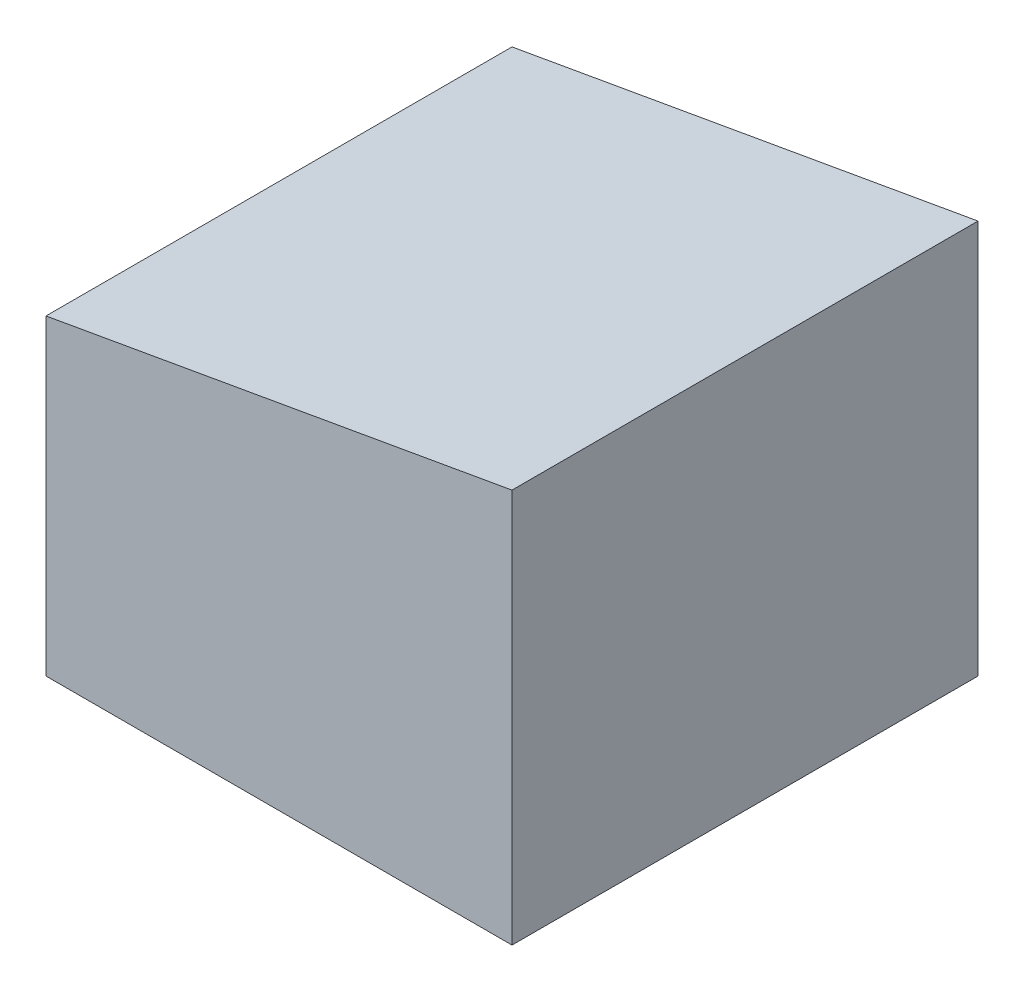
ISO-10303-21;
HEADER;
FILE_DESCRIPTION(('STEP AP214'),'2;1');
FILE_NAME('part.step','',(''),(''),'','','');
FILE_SCHEMA(('AUTOMOTIVE_DESIGN { 1 0 10303 214 1 1 1 1 }'));
ENDSEC;
DATA;
#1=APPLICATION_CONTEXT('core data for automotive mechanical design processes');
#2=APPLICATION_PROTOCOL_DEFINITION('international standard','automotive_design',2000,#1);
#3=PRODUCT_CONTEXT('',#1,'mechanical');
#4=PRODUCT('Part','Part','',(#3));
#5=PRODUCT_RELATED_PRODUCT_CATEGORY('part','',(#4));
#6=PRODUCT_DEFINITION_FORMATION('','',#4);
#7=PRODUCT_DEFINITION_CONTEXT('part definition',#1,'design');
#8=PRODUCT_DEFINITION('design','',#6,#7);
#9=PRODUCT_DEFINITION_SHAPE('','',#8);
#10=(LENGTH_UNIT() NAMED_UNIT(*) SI_UNIT(.MILLI.,.METRE.));
#11=(NAMED_UNIT(*) PLANE_ANGLE_UNIT() SI_UNIT($,.RADIAN.));
#12=(NAMED_UNIT(*) SI_UNIT($,.STERADIAN.) SOLID_ANGLE_UNIT());
#13=UNCERTAINTY_MEASURE_WITH_UNIT(LENGTH_MEASURE(1.E-05),#10,'distance_accuracy_value','');
#14=(GEOMETRIC_REPRESENTATION_CONTEXT(3) GLOBAL_UNCERTAINTY_ASSIGNED_CONTEXT((#13)) GLOBAL_UNIT_ASSIGNED_CONTEXT((#10,
#11,#12)) REPRESENTATION_CONTEXT('',''));
#15=CARTESIAN_POINT('',(0.,0.,0.));
#16=DIRECTION('',(0.,0.,1.));
#17=DIRECTION('',(1.,0.,0.));
#18=AXIS2_PLACEMENT_3D('',#15,#16,#17);
#19=CARTESIAN_POINT('',(0.,0.,50.8));
#20=DIRECTION('',(1.,0.,0.));
#21=DIRECTION('',(0.,0.,-1.));
#22=AXIS2_PLACEMENT_3D('',#19,#20,#21);
#23=PLANE('',#22);
#24=DIRECTION('',(0.,-1.,0.));
#25=VECTOR('',#24,1.);
#26=CARTESIAN_POINT('',(0.,0.,0.));
#27=LINE('',#26,#25);
#28=CARTESIAN_POINT('',(0.,34.,0.));
#29=VERTEX_POINT('',#28);
#30=CARTESIAN_POINT('',(0.,0.,0.));
#31=VERTEX_POINT('',#30);
#32=EDGE_CURVE('E100',#29,#31,#27,.T.);
#33=ORIENTED_EDGE('',*,*,#32,.T.);
#34=DIRECTION('',(0.,0.,-1.));
#35=VECTOR('',#34,1.);
#36=CARTESIAN_POINT('',(0.,0.,50.8));
#37=LINE('',#36,#35);
#38=CARTESIAN_POINT('',(0.,0.,50.8));
#39=VERTEX_POINT('',#38);
#40=EDGE_CURVE('E11',#39,#31,#37,.T.);
#41=ORIENTED_EDGE('',*,*,#40,.F.);
#42=DIRECTION('',(0.,-1.,0.));
#43=VECTOR('',#42,1.);
#44=CARTESIAN_POINT('',(0.,0.,50.8));
#45=LINE('',#44,#43);
#46=CARTESIAN_POINT('',(0.,34.,50.8));
#47=VERTEX_POINT('',#46);
#48=EDGE_CURVE('E88',#47,#39,#45,.T.);
#49=ORIENTED_EDGE('',*,*,#48,.F.);
#50=DIRECTION('',(0.,0.,-1.));
#51=VECTOR('',#50,1.);
#52=CARTESIAN_POINT('',(0.,34.,50.8));
#53=LINE('',#52,#51);
#54=EDGE_CURVE('E96',#47,#29,#53,.T.);
#55=ORIENTED_EDGE('',*,*,#54,.T.);
#56=EDGE_LOOP('',(#33,#41,#49,#55));
#57=FACE_BOUND('',#56,.T.);
#58=ADVANCED_FACE('F37',(#57),#23,.F.);
#59=CARTESIAN_POINT('',(0.,0.,50.8));
#60=DIRECTION('',(0.,1.,0.));
#61=DIRECTION('',(0.,0.,1.));
#62=AXIS2_PLACEMENT_3D('',#59,#60,#61);
#63=PLANE('',#62);
#64=DIRECTION('',(1.,0.,0.));
#65=VECTOR('',#64,1.);
#66=CARTESIAN_POINT('',(0.,0.,0.));
#67=LINE('',#66,#65);
#68=CARTESIAN_POINT('',(50.8,0.,0.));
#69=VERTEX_POINT('',#68);
#70=EDGE_CURVE('E92',#31,#69,#67,.T.);
#71=ORIENTED_EDGE('',*,*,#70,.T.);
#72=DIRECTION('',(0.,0.,-1.));
#73=VECTOR('',#72,1.);
#74=CARTESIAN_POINT('',(50.8,0.,50.8));
#75=LINE('',#74,#73);
#76=CARTESIAN_POINT('',(50.8,0.,50.8));
#77=VERTEX_POINT('',#76);
#78=EDGE_CURVE('E45',#77,#69,#75,.T.);
#79=ORIENTED_EDGE('',*,*,#78,.F.);
#80=DIRECTION('',(1.,0.,0.));
#81=VECTOR('',#80,1.);
#82=CARTESIAN_POINT('',(0.,0.,50.8));
#83=LINE('',#82,#81);
#84=EDGE_CURVE('E83',#39,#77,#83,.T.);
#85=ORIENTED_EDGE('',*,*,#84,.F.);
#86=ORIENTED_EDGE('',*,*,#40,.T.);
#87=EDGE_LOOP('',(#71,#79,#85,#86));
#88=FACE_BOUND('',#87,.T.);
#89=ADVANCED_FACE('F91',(#88),#63,.F.);
#90=CARTESIAN_POINT('',(50.8,0.,50.8));
#91=DIRECTION('',(-1.,0.,0.));
#92=DIRECTION('',(0.,0.,1.));
#93=AXIS2_PLACEMENT_3D('',#90,#91,#92);
#94=PLANE('',#93);
#95=DIRECTION('',(0.,1.,0.));
#96=VECTOR('',#95,1.);
#97=CARTESIAN_POINT('',(50.8,0.,0.));
#98=LINE('',#97,#96);
#99=CARTESIAN_POINT('',(50.8,42.9574106199903,0.));
#100=VERTEX_POINT('',#99);
#101=EDGE_CURVE('E70',#69,#100,#98,.T.);
#102=ORIENTED_EDGE('',*,*,#101,.T.);
#103=DIRECTION('',(0.,0.,-1.));
#104=VECTOR('',#103,1.);
#105=CARTESIAN_POINT('',(50.8,42.9574106199903,50.8));
#106=LINE('',#105,#104);
#107=CARTESIAN_POINT('',(50.8,42.9574106199903,50.8));
#108=VERTEX_POINT('',#107);
#109=EDGE_CURVE('E93',#108,#100,#106,.T.);
#110=ORIENTED_EDGE('',*,*,#109,.F.);
#111=DIRECTION('',(0.,1.,0.));
#112=VECTOR('',#111,1.);
#113=CARTESIAN_POINT('',(50.8,0.,50.8));
#114=LINE('',#113,#112);
#115=EDGE_CURVE('E86',#77,#108,#114,.T.);
#116=ORIENTED_EDGE('',*,*,#115,.F.);
#117=ORIENTED_EDGE('',*,*,#78,.T.);
#118=EDGE_LOOP('',(#102,#110,#116,#117));
#119=FACE_BOUND('',#118,.T.);
#120=ADVANCED_FACE('F94',(#119),#94,.F.);
#121=CARTESIAN_POINT('',(50.8,42.9574106199903,50.8));
#122=DIRECTION('',(0.173648177666935,-0.984807753012207,0.));
#123=DIRECTION('',(0.984807753012207,0.173648177666935,0.));
#124=AXIS2_PLACEMENT_3D('',#121,#122,#123);
#125=PLANE('',#124);
#126=DIRECTION('',(-0.984807753012207,-0.173648177666935,0.));
#127=VECTOR('',#126,1.);
#128=CARTESIAN_POINT('',(50.8,42.9574106199903,0.));
#129=LINE('',#128,#127);
#130=EDGE_CURVE('E76',#100,#29,#129,.T.);
#131=ORIENTED_EDGE('',*,*,#130,.T.);
#132=ORIENTED_EDGE('',*,*,#54,.F.);
#133=DIRECTION('',(-0.984807753012207,-0.173648177666935,0.));
#134=VECTOR('',#133,1.);
#135=CARTESIAN_POINT('',(50.8,42.9574106199903,50.8));
#136=LINE('',#135,#134);
#137=EDGE_CURVE('E53',#108,#47,#136,.T.);
#138=ORIENTED_EDGE('',*,*,#137,.F.);
#139=ORIENTED_EDGE('',*,*,#109,.T.);
#140=EDGE_LOOP('',(#131,#132,#138,#139));
#141=FACE_BOUND('',#140,.T.);
#142=ADVANCED_FACE('F107',(#141),#125,.F.);
#143=CARTESIAN_POINT('',(0.,0.,50.8));
#144=DIRECTION('',(0.,0.,-1.));
#145=DIRECTION('',(-1.,0.,0.));
#146=AXIS2_PLACEMENT_3D('',#143,#144,#145);
#147=PLANE('',#146);
#148=ORIENTED_EDGE('',*,*,#48,.T.);
#149=ORIENTED_EDGE('',*,*,#84,.T.);
#150=ORIENTED_EDGE('',*,*,#115,.T.);
#151=ORIENTED_EDGE('',*,*,#137,.T.);
#152=EDGE_LOOP('',(#148,#149,#150,#151));
#153=FACE_BOUND('',#152,.T.);
#154=ADVANCED_FACE('F84',(#153),#147,.F.);
#155=CARTESIAN_POINT('',(0.,0.,0.));
#156=DIRECTION('',(0.,0.,-1.));
#157=DIRECTION('',(-1.,0.,0.));
#158=AXIS2_PLACEMENT_3D('',#155,#156,#157);
#159=PLANE('',#158);
#160=ORIENTED_EDGE('',*,*,#32,.F.);
#161=ORIENTED_EDGE('',*,*,#130,.F.);
#162=ORIENTED_EDGE('',*,*,#101,.F.);
#163=ORIENTED_EDGE('',*,*,#70,.F.);
#164=EDGE_LOOP('',(#160,#161,#162,#163));
#165=FACE_BOUND('',#164,.T.);
#166=ADVANCED_FACE('F110',(#165),#159,.T.);
#167=CLOSED_SHELL('',(#58,#89,#120,#142,#154,#166));
#168=MANIFOLD_SOLID_BREP('B2',#167);
#169=ADVANCED_BREP_SHAPE_REPRESENTATION('',(#18,#168),#14);
#170=SHAPE_DEFINITION_REPRESENTATION(#9,#169);
ENDSEC;
END-ISO-10303-21;
